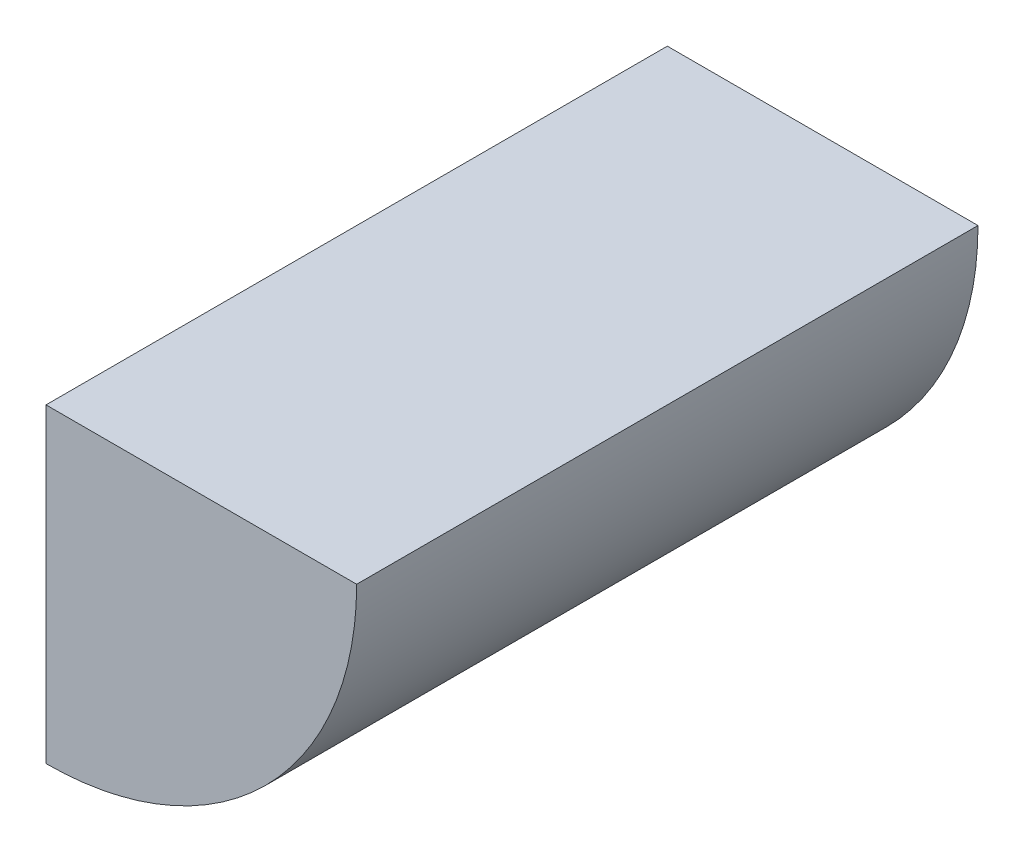
ISO-10303-21;
HEADER;
FILE_DESCRIPTION(('STEP AP214'),'2;1');
FILE_NAME('part.step','',(''),(''),'','','');
FILE_SCHEMA(('AUTOMOTIVE_DESIGN { 1 0 10303 214 1 1 1 1 }'));
ENDSEC;
DATA;
#1=APPLICATION_CONTEXT('core data for automotive mechanical design processes');
#2=APPLICATION_PROTOCOL_DEFINITION('international standard','automotive_design',2000,#1);
#3=PRODUCT_CONTEXT('',#1,'mechanical');
#4=PRODUCT('Part','Part','',(#3));
#5=PRODUCT_RELATED_PRODUCT_CATEGORY('part','',(#4));
#6=PRODUCT_DEFINITION_FORMATION('','',#4);
#7=PRODUCT_DEFINITION_CONTEXT('part definition',#1,'design');
#8=PRODUCT_DEFINITION('design','',#6,#7);
#9=PRODUCT_DEFINITION_SHAPE('','',#8);
#10=(LENGTH_UNIT() NAMED_UNIT(*) SI_UNIT(.MILLI.,.METRE.));
#11=(NAMED_UNIT(*) PLANE_ANGLE_UNIT() SI_UNIT($,.RADIAN.));
#12=(NAMED_UNIT(*) SI_UNIT($,.STERADIAN.) SOLID_ANGLE_UNIT());
#13=UNCERTAINTY_MEASURE_WITH_UNIT(LENGTH_MEASURE(1.E-05),#10,'distance_accuracy_value','');
#14=(GEOMETRIC_REPRESENTATION_CONTEXT(3) GLOBAL_UNCERTAINTY_ASSIGNED_CONTEXT((#13)) GLOBAL_UNIT_ASSIGNED_CONTEXT((#10,
#11,#12)) REPRESENTATION_CONTEXT('',''));
#15=CARTESIAN_POINT('',(0.,0.,0.));
#16=DIRECTION('',(0.,0.,1.));
#17=DIRECTION('',(1.,0.,0.));
#18=AXIS2_PLACEMENT_3D('',#15,#16,#17);
#19=CARTESIAN_POINT('',(0.,0.,50.));
#20=DIRECTION('',(0.,-1.,0.));
#21=DIRECTION('',(0.,0.,-1.));
#22=AXIS2_PLACEMENT_3D('',#19,#20,#21);
#23=PLANE('',#22);
#24=DIRECTION('',(-1.,0.,0.));
#25=VECTOR('',#24,1.);
#26=CARTESIAN_POINT('',(0.,0.,0.));
#27=LINE('',#26,#25);
#28=CARTESIAN_POINT('',(25.,0.,0.));
#29=VERTEX_POINT('',#28);
#30=CARTESIAN_POINT('',(0.,0.,0.));
#31=VERTEX_POINT('',#30);
#32=EDGE_CURVE('E80',#29,#31,#27,.T.);
#33=ORIENTED_EDGE('',*,*,#32,.T.);
#34=DIRECTION('',(0.,0.,-1.));
#35=VECTOR('',#34,1.);
#36=CARTESIAN_POINT('',(0.,0.,50.));
#37=LINE('',#36,#35);
#38=CARTESIAN_POINT('',(0.,0.,50.));
#39=VERTEX_POINT('',#38);
#40=EDGE_CURVE('E11',#39,#31,#37,.T.);
#41=ORIENTED_EDGE('',*,*,#40,.F.);
#42=DIRECTION('',(-1.,0.,0.));
#43=VECTOR('',#42,1.);
#44=CARTESIAN_POINT('',(0.,0.,50.));
#45=LINE('',#44,#43);
#46=CARTESIAN_POINT('',(25.,0.,50.));
#47=VERTEX_POINT('',#46);
#48=EDGE_CURVE('E73',#47,#39,#45,.T.);
#49=ORIENTED_EDGE('',*,*,#48,.F.);
#50=DIRECTION('',(0.,0.,-1.));
#51=VECTOR('',#50,1.);
#52=CARTESIAN_POINT('',(25.,0.,50.));
#53=LINE('',#52,#51);
#54=EDGE_CURVE('E81',#47,#29,#53,.T.);
#55=ORIENTED_EDGE('',*,*,#54,.T.);
#56=EDGE_LOOP('',(#33,#41,#49,#55));
#57=FACE_BOUND('',#56,.T.);
#58=ADVANCED_FACE('F33',(#57),#23,.F.);
#59=CARTESIAN_POINT('',(0.,0.,50.));
#60=DIRECTION('',(1.,0.,0.));
#61=DIRECTION('',(0.,0.,-1.));
#62=AXIS2_PLACEMENT_3D('',#59,#60,#61);
#63=PLANE('',#62);
#64=DIRECTION('',(0.,-1.,0.));
#65=VECTOR('',#64,1.);
#66=CARTESIAN_POINT('',(0.,0.,0.));
#67=LINE('',#66,#65);
#68=CARTESIAN_POINT('',(0.,-25.,0.));
#69=VERTEX_POINT('',#68);
#70=EDGE_CURVE('E61',#31,#69,#67,.T.);
#71=ORIENTED_EDGE('',*,*,#70,.T.);
#72=DIRECTION('',(0.,0.,-1.));
#73=VECTOR('',#72,1.);
#74=CARTESIAN_POINT('',(0.,-25.,50.));
#75=LINE('',#74,#73);
#76=CARTESIAN_POINT('',(0.,-25.,50.));
#77=VERTEX_POINT('',#76);
#78=EDGE_CURVE('E41',#77,#69,#75,.T.);
#79=ORIENTED_EDGE('',*,*,#78,.F.);
#80=DIRECTION('',(0.,-1.,0.));
#81=VECTOR('',#80,1.);
#82=CARTESIAN_POINT('',(0.,0.,50.));
#83=LINE('',#82,#81);
#84=EDGE_CURVE('E69',#39,#77,#83,.T.);
#85=ORIENTED_EDGE('',*,*,#84,.F.);
#86=ORIENTED_EDGE('',*,*,#40,.T.);
#87=EDGE_LOOP('',(#71,#79,#85,#86));
#88=FACE_BOUND('',#87,.T.);
#89=ADVANCED_FACE('F70',(#88),#63,.F.);
#90=CARTESIAN_POINT('',(0.,0.,50.));
#91=DIRECTION('',(0.,0.,-1.));
#92=DIRECTION('',(-1.,0.,0.));
#93=AXIS2_PLACEMENT_3D('',#90,#91,#92);
#94=CYLINDRICAL_SURFACE('',#93,25.);
#95=CARTESIAN_POINT('',(0.,0.,0.));
#96=DIRECTION('',(0.,0.,1.));
#97=DIRECTION('',(1.,0.,0.));
#98=AXIS2_PLACEMENT_3D('',#95,#96,#97);
#99=CIRCLE('',#98,25.);
#100=EDGE_CURVE('E66',#69,#29,#99,.T.);
#101=ORIENTED_EDGE('',*,*,#100,.T.);
#102=ORIENTED_EDGE('',*,*,#54,.F.);
#103=CARTESIAN_POINT('',(0.,0.,50.));
#104=DIRECTION('',(0.,0.,1.));
#105=DIRECTION('',(1.,0.,0.));
#106=AXIS2_PLACEMENT_3D('',#103,#104,#105);
#107=CIRCLE('',#106,25.);
#108=EDGE_CURVE('E49',#77,#47,#107,.T.);
#109=ORIENTED_EDGE('',*,*,#108,.F.);
#110=ORIENTED_EDGE('',*,*,#78,.T.);
#111=EDGE_LOOP('',(#101,#102,#109,#110));
#112=FACE_BOUND('',#111,.T.);
#113=ADVANCED_FACE('F92',(#112),#94,.T.);
#114=CARTESIAN_POINT('',(0.,0.,50.));
#115=DIRECTION('',(0.,0.,1.));
#116=DIRECTION('',(1.,0.,0.));
#117=AXIS2_PLACEMENT_3D('',#114,#115,#116);
#118=PLANE('',#117);
#119=ORIENTED_EDGE('',*,*,#48,.T.);
#120=ORIENTED_EDGE('',*,*,#84,.T.);
#121=ORIENTED_EDGE('',*,*,#108,.T.);
#122=EDGE_LOOP('',(#119,#120,#121));
#123=FACE_BOUND('',#122,.T.);
#124=ADVANCED_FACE('F76',(#123),#118,.T.);
#125=CARTESIAN_POINT('',(0.,0.,0.));
#126=DIRECTION('',(0.,0.,1.));
#127=DIRECTION('',(1.,0.,0.));
#128=AXIS2_PLACEMENT_3D('',#125,#126,#127);
#129=PLANE('',#128);
#130=CARTESIAN_POINT('',(10.126254825152,-9.97653242307878,0.));
#131=DIRECTION('',(0.,0.,-1.));
#132=DIRECTION('',(-1.,0.,0.));
#133=AXIS2_PLACEMENT_3D('',#130,#131,#132);
#134=CIRCLE('',#133,5.);
#135=CARTESIAN_POINT('',(5.12625482515201,-9.97653242307878,0.));
#136=VERTEX_POINT('',#135);
#137=EDGE_CURVE('E87',#136,#136,#134,.T.);
#138=ORIENTED_EDGE('',*,*,#137,.F.);
#139=EDGE_LOOP('',(#138));
#140=FACE_BOUND('',#139,.T.);
#141=ORIENTED_EDGE('',*,*,#32,.F.);
#142=ORIENTED_EDGE('',*,*,#100,.F.);
#143=ORIENTED_EDGE('',*,*,#70,.F.);
#144=EDGE_LOOP('',(#141,#142,#143));
#145=FACE_BOUND('',#144,.T.);
#146=ADVANCED_FACE('F93',(#140,#145),#129,.F.);
#147=CARTESIAN_POINT('',(10.126254825152,-9.97653242307878,10.));
#148=DIRECTION('',(0.,0.,-1.));
#149=DIRECTION('',(-1.,0.,0.));
#150=AXIS2_PLACEMENT_3D('',#147,#148,#149);
#151=CYLINDRICAL_SURFACE('',#150,5.);
#152=CARTESIAN_POINT('',(10.126254825152,-9.97653242307878,10.));
#153=DIRECTION('',(0.,0.,-1.));
#154=DIRECTION('',(-1.,0.,0.));
#155=AXIS2_PLACEMENT_3D('',#152,#153,#154);
#156=CIRCLE('',#155,5.);
#157=CARTESIAN_POINT('',(5.12625482515201,-9.97653242307878,10.));
#158=VERTEX_POINT('',#157);
#159=EDGE_CURVE('E83',#158,#158,#156,.T.);
#160=ORIENTED_EDGE('',*,*,#159,.F.);
#161=EDGE_LOOP('',(#160));
#162=FACE_BOUND('',#161,.T.);
#163=ORIENTED_EDGE('',*,*,#137,.T.);
#164=EDGE_LOOP('',(#163));
#165=FACE_BOUND('',#164,.T.);
#166=ADVANCED_FACE('F95',(#162,#165),#151,.F.);
#167=CARTESIAN_POINT('',(10.126254825152,-9.97653242307878,10.));
#168=DIRECTION('',(0.,0.,-1.));
#169=DIRECTION('',(-1.,0.,0.));
#170=AXIS2_PLACEMENT_3D('',#167,#168,#169);
#171=PLANE('',#170);
#172=ORIENTED_EDGE('',*,*,#159,.T.);
#173=EDGE_LOOP('',(#172));
#174=FACE_BOUND('',#173,.T.);
#175=ADVANCED_FACE('F102',(#174),#171,.T.);
#176=CLOSED_SHELL('',(#58,#89,#113,#124,#146,#166,#175));
#177=MANIFOLD_SOLID_BREP('B2',#176);
#178=ADVANCED_BREP_SHAPE_REPRESENTATION('',(#18,#177),#14);
#179=SHAPE_DEFINITION_REPRESENTATION(#9,#178);
ENDSEC;
END-ISO-10303-21;
